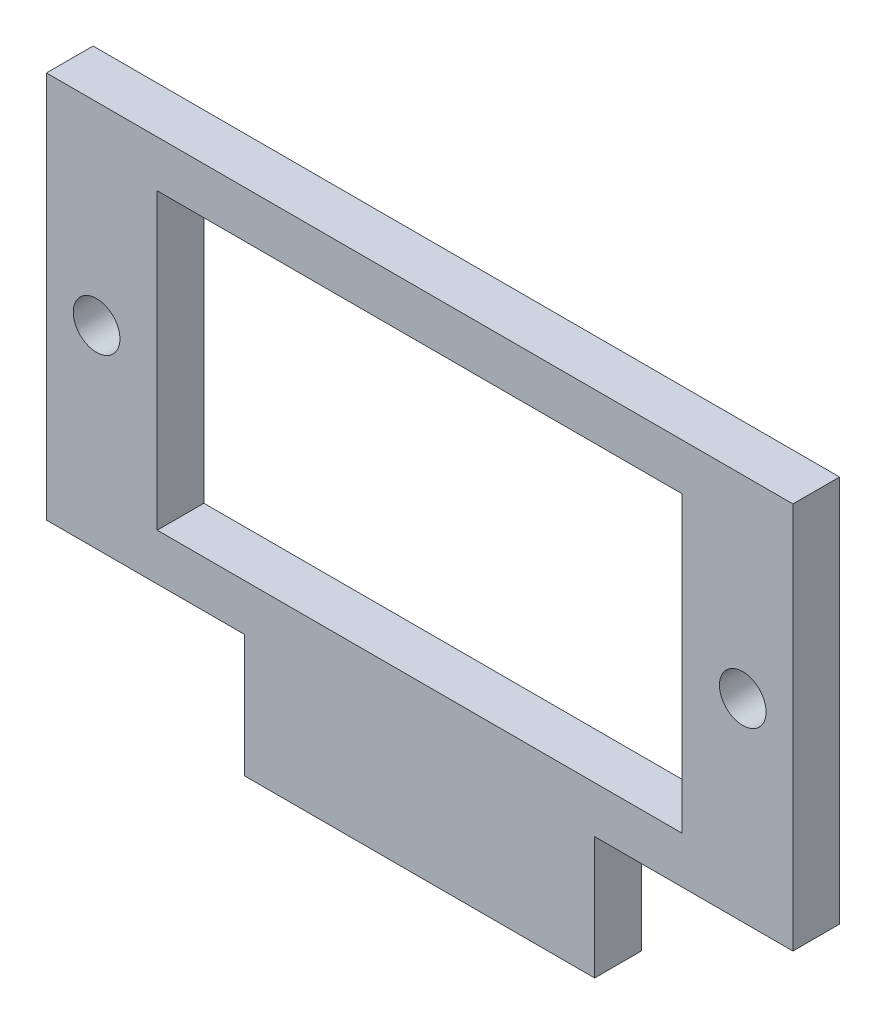
ISO-10303-21;
HEADER;
FILE_DESCRIPTION(('STEP AP214'),'2;1');
FILE_NAME('part.step','',(''),(''),'','','');
FILE_SCHEMA(('AUTOMOTIVE_DESIGN { 1 0 10303 214 1 1 1 1 }'));
ENDSEC;
DATA;
#1=APPLICATION_CONTEXT('core data for automotive mechanical design processes');
#2=APPLICATION_PROTOCOL_DEFINITION('international standard','automotive_design',2000,#1);
#3=PRODUCT_CONTEXT('',#1,'mechanical');
#4=PRODUCT('Part','Part','',(#3));
#5=PRODUCT_RELATED_PRODUCT_CATEGORY('part','',(#4));
#6=PRODUCT_DEFINITION_FORMATION('','',#4);
#7=PRODUCT_DEFINITION_CONTEXT('part definition',#1,'design');
#8=PRODUCT_DEFINITION('design','',#6,#7);
#9=PRODUCT_DEFINITION_SHAPE('','',#8);
#10=(LENGTH_UNIT() NAMED_UNIT(*) SI_UNIT(.MILLI.,.METRE.));
#11=(NAMED_UNIT(*) PLANE_ANGLE_UNIT() SI_UNIT($,.RADIAN.));
#12=(NAMED_UNIT(*) SI_UNIT($,.STERADIAN.) SOLID_ANGLE_UNIT());
#13=UNCERTAINTY_MEASURE_WITH_UNIT(LENGTH_MEASURE(1.E-05),#10,'distance_accuracy_value','');
#14=(GEOMETRIC_REPRESENTATION_CONTEXT(3) GLOBAL_UNCERTAINTY_ASSIGNED_CONTEXT((#13)) GLOBAL_UNIT_ASSIGNED_CONTEXT((#10,
#11,#12)) REPRESENTATION_CONTEXT('',''));
#15=CARTESIAN_POINT('',(0.,0.,0.));
#16=DIRECTION('',(0.,0.,1.));
#17=DIRECTION('',(1.,0.,0.));
#18=AXIS2_PLACEMENT_3D('',#15,#16,#17);
#19=CARTESIAN_POINT('',(-16.,-8.3,2.));
#20=DIRECTION('',(0.,1.,0.));
#21=DIRECTION('',(0.,0.,1.));
#22=AXIS2_PLACEMENT_3D('',#19,#20,#21);
#23=PLANE('',#22);
#24=DIRECTION('',(0.,0.,-1.));
#25=VECTOR('',#24,1.);
#26=CARTESIAN_POINT('',(-7.5,-8.3,2.));
#27=LINE('',#26,#25);
#28=CARTESIAN_POINT('',(-7.5,-8.3,2.));
#29=VERTEX_POINT('',#28);
#30=CARTESIAN_POINT('',(-7.5,-8.3,0.));
#31=VERTEX_POINT('',#30);
#32=EDGE_CURVE('E55',#29,#31,#27,.T.);
#33=ORIENTED_EDGE('',*,*,#32,.F.);
#34=DIRECTION('',(1.,0.,0.));
#35=VECTOR('',#34,1.);
#36=CARTESIAN_POINT('',(-16.,-8.3,2.));
#37=LINE('',#36,#35);
#38=CARTESIAN_POINT('',(-16.,-8.3,2.));
#39=VERTEX_POINT('',#38);
#40=EDGE_CURVE('E235',#39,#29,#37,.T.);
#41=ORIENTED_EDGE('',*,*,#40,.F.);
#42=DIRECTION('',(0.,0.,-1.));
#43=VECTOR('',#42,1.);
#44=CARTESIAN_POINT('',(-16.,-8.3,2.));
#45=LINE('',#44,#43);
#46=CARTESIAN_POINT('',(-16.,-8.3,0.));
#47=VERTEX_POINT('',#46);
#48=EDGE_CURVE('E254',#39,#47,#45,.T.);
#49=ORIENTED_EDGE('',*,*,#48,.T.);
#50=DIRECTION('',(1.,0.,0.));
#51=VECTOR('',#50,1.);
#52=CARTESIAN_POINT('',(-16.,-8.3,0.));
#53=LINE('',#52,#51);
#54=EDGE_CURVE('E228',#47,#31,#53,.T.);
#55=ORIENTED_EDGE('',*,*,#54,.T.);
#56=EDGE_LOOP('',(#33,#41,#49,#55));
#57=FACE_BOUND('',#56,.T.);
#58=ADVANCED_FACE('F39',(#57),#23,.F.);
#59=DIRECTION('',(0.,0.,1.));
#60=VECTOR('',#59,1.);
#61=CARTESIAN_POINT('',(7.5,-8.3,2.));
#62=LINE('',#61,#60);
#63=CARTESIAN_POINT('',(7.5,-8.3,0.));
#64=VERTEX_POINT('',#63);
#65=CARTESIAN_POINT('',(7.5,-8.3,2.));
#66=VERTEX_POINT('',#65);
#67=EDGE_CURVE('E63',#64,#66,#62,.T.);
#68=ORIENTED_EDGE('',*,*,#67,.F.);
#69=CARTESIAN_POINT('',(16.,-8.3,0.));
#70=VERTEX_POINT('',#69);
#71=EDGE_CURVE('E248',#64,#70,#53,.T.);
#72=ORIENTED_EDGE('',*,*,#71,.T.);
#73=DIRECTION('',(0.,0.,-1.));
#74=VECTOR('',#73,1.);
#75=CARTESIAN_POINT('',(16.,-8.3,2.));
#76=LINE('',#75,#74);
#77=CARTESIAN_POINT('',(16.,-8.3,2.));
#78=VERTEX_POINT('',#77);
#79=EDGE_CURVE('E238',#78,#70,#76,.T.);
#80=ORIENTED_EDGE('',*,*,#79,.F.);
#81=EDGE_CURVE('E234',#66,#78,#37,.T.);
#82=ORIENTED_EDGE('',*,*,#81,.F.);
#83=EDGE_LOOP('',(#68,#72,#80,#82));
#84=FACE_BOUND('',#83,.T.);
#85=ADVANCED_FACE('F289',(#84),#23,.F.);
#86=CARTESIAN_POINT('',(0.,0.,2.));
#87=DIRECTION('',(0.,0.,1.));
#88=DIRECTION('',(1.,0.,0.));
#89=AXIS2_PLACEMENT_3D('',#86,#87,#88);
#90=PLANE('',#89);
#91=CARTESIAN_POINT('',(-13.85,0.,2.));
#92=DIRECTION('',(0.,0.,1.));
#93=DIRECTION('',(1.,0.,0.));
#94=AXIS2_PLACEMENT_3D('',#91,#92,#93);
#95=CIRCLE('',#94,1.);
#96=CARTESIAN_POINT('',(-12.85,0.,2.));
#97=VERTEX_POINT('',#96);
#98=EDGE_CURVE('E172',#97,#97,#95,.T.);
#99=ORIENTED_EDGE('',*,*,#98,.F.);
#100=EDGE_LOOP('',(#99));
#101=FACE_BOUND('',#100,.T.);
#102=DIRECTION('',(0.,1.,0.));
#103=VECTOR('',#102,1.);
#104=CARTESIAN_POINT('',(16.,8.3,2.));
#105=LINE('',#104,#103);
#106=CARTESIAN_POINT('',(16.,8.3,2.));
#107=VERTEX_POINT('',#106);
#108=EDGE_CURVE('E223',#78,#107,#105,.T.);
#109=ORIENTED_EDGE('',*,*,#108,.T.);
#110=DIRECTION('',(-1.,0.,0.));
#111=VECTOR('',#110,1.);
#112=CARTESIAN_POINT('',(-16.,8.3,2.));
#113=LINE('',#112,#111);
#114=CARTESIAN_POINT('',(-16.,8.3,2.));
#115=VERTEX_POINT('',#114);
#116=EDGE_CURVE('E227',#107,#115,#113,.T.);
#117=ORIENTED_EDGE('',*,*,#116,.T.);
#118=DIRECTION('',(0.,-1.,0.));
#119=VECTOR('',#118,1.);
#120=CARTESIAN_POINT('',(-16.,8.3,2.));
#121=LINE('',#120,#119);
#122=EDGE_CURVE('E231',#115,#39,#121,.T.);
#123=ORIENTED_EDGE('',*,*,#122,.T.);
#124=ORIENTED_EDGE('',*,*,#40,.T.);
#125=DIRECTION('',(0.,1.,0.));
#126=VECTOR('',#125,1.);
#127=CARTESIAN_POINT('',(-7.5,-13.55,2.));
#128=LINE('',#127,#126);
#129=CARTESIAN_POINT('',(-7.5,-13.55,2.));
#130=VERTEX_POINT('',#129);
#131=EDGE_CURVE('E269',#130,#29,#128,.T.);
#132=ORIENTED_EDGE('',*,*,#131,.F.);
#133=DIRECTION('',(-1.,0.,0.));
#134=VECTOR('',#133,1.);
#135=CARTESIAN_POINT('',(-7.5,-13.55,2.));
#136=LINE('',#135,#134);
#137=CARTESIAN_POINT('',(7.5,-13.55,2.));
#138=VERTEX_POINT('',#137);
#139=EDGE_CURVE('E149',#138,#130,#136,.T.);
#140=ORIENTED_EDGE('',*,*,#139,.F.);
#141=DIRECTION('',(0.,1.,0.));
#142=VECTOR('',#141,1.);
#143=CARTESIAN_POINT('',(7.5,-13.55,2.));
#144=LINE('',#143,#142);
#145=EDGE_CURVE('E164',#138,#66,#144,.T.);
#146=ORIENTED_EDGE('',*,*,#145,.T.);
#147=ORIENTED_EDGE('',*,*,#81,.T.);
#148=EDGE_LOOP('',(#109,#117,#123,#124,#132,#140,#146,#147));
#149=FACE_BOUND('',#148,.T.);
#150=DIRECTION('',(-1.,0.,0.));
#151=VECTOR('',#150,1.);
#152=CARTESIAN_POINT('',(-11.25,6.3,2.));
#153=LINE('',#152,#151);
#154=CARTESIAN_POINT('',(11.25,6.3,2.));
#155=VERTEX_POINT('',#154);
#156=CARTESIAN_POINT('',(-11.25,6.3,2.));
#157=VERTEX_POINT('',#156);
#158=EDGE_CURVE('E183',#155,#157,#153,.T.);
#159=ORIENTED_EDGE('',*,*,#158,.F.);
#160=DIRECTION('',(0.,1.,0.));
#161=VECTOR('',#160,1.);
#162=CARTESIAN_POINT('',(11.25,6.3,2.));
#163=LINE('',#162,#161);
#164=CARTESIAN_POINT('',(11.25,-6.3,2.));
#165=VERTEX_POINT('',#164);
#166=EDGE_CURVE('E180',#165,#155,#163,.T.);
#167=ORIENTED_EDGE('',*,*,#166,.F.);
#168=DIRECTION('',(1.,0.,0.));
#169=VECTOR('',#168,1.);
#170=CARTESIAN_POINT('',(-11.25,-6.3,2.));
#171=LINE('',#170,#169);
#172=CARTESIAN_POINT('',(-11.25,-6.3,2.));
#173=VERTEX_POINT('',#172);
#174=EDGE_CURVE('E191',#173,#165,#171,.T.);
#175=ORIENTED_EDGE('',*,*,#174,.F.);
#176=DIRECTION('',(0.,-1.,0.));
#177=VECTOR('',#176,1.);
#178=CARTESIAN_POINT('',(-11.25,6.3,2.));
#179=LINE('',#178,#177);
#180=EDGE_CURVE('E187',#157,#173,#179,.T.);
#181=ORIENTED_EDGE('',*,*,#180,.F.);
#182=EDGE_LOOP('',(#159,#167,#175,#181));
#183=FACE_BOUND('',#182,.T.);
#184=CARTESIAN_POINT('',(13.85,0.,2.));
#185=DIRECTION('',(0.,0.,1.));
#186=DIRECTION('',(1.,0.,0.));
#187=AXIS2_PLACEMENT_3D('',#184,#185,#186);
#188=CIRCLE('',#187,1.);
#189=CARTESIAN_POINT('',(14.85,0.,2.));
#190=VERTEX_POINT('',#189);
#191=EDGE_CURVE('E162',#190,#190,#188,.T.);
#192=ORIENTED_EDGE('',*,*,#191,.F.);
#193=EDGE_LOOP('',(#192));
#194=FACE_BOUND('',#193,.T.);
#195=ADVANCED_FACE('F267',(#101,#149,#183,#194),#90,.T.);
#196=CARTESIAN_POINT('',(0.,0.,0.));
#197=DIRECTION('',(0.,0.,1.));
#198=DIRECTION('',(1.,0.,0.));
#199=AXIS2_PLACEMENT_3D('',#196,#197,#198);
#200=PLANE('',#199);
#201=DIRECTION('',(0.,1.,0.));
#202=VECTOR('',#201,1.);
#203=CARTESIAN_POINT('',(16.,8.3,0.));
#204=LINE('',#203,#202);
#205=CARTESIAN_POINT('',(16.,8.3,0.));
#206=VERTEX_POINT('',#205);
#207=EDGE_CURVE('E222',#70,#206,#204,.T.);
#208=ORIENTED_EDGE('',*,*,#207,.F.);
#209=ORIENTED_EDGE('',*,*,#71,.F.);
#210=DIRECTION('',(0.,1.,0.));
#211=VECTOR('',#210,1.);
#212=CARTESIAN_POINT('',(7.5,-13.55,0.));
#213=LINE('',#212,#211);
#214=CARTESIAN_POINT('',(7.5,-13.55,0.));
#215=VERTEX_POINT('',#214);
#216=EDGE_CURVE('E139',#215,#64,#213,.T.);
#217=ORIENTED_EDGE('',*,*,#216,.F.);
#218=DIRECTION('',(1.,0.,0.));
#219=VECTOR('',#218,1.);
#220=CARTESIAN_POINT('',(-7.5,-13.55,0.));
#221=LINE('',#220,#219);
#222=CARTESIAN_POINT('',(-7.5,-13.55,0.));
#223=VERTEX_POINT('',#222);
#224=EDGE_CURVE('E130',#223,#215,#221,.T.);
#225=ORIENTED_EDGE('',*,*,#224,.F.);
#226=DIRECTION('',(0.,1.,0.));
#227=VECTOR('',#226,1.);
#228=CARTESIAN_POINT('',(-7.5,-13.55,0.));
#229=LINE('',#228,#227);
#230=EDGE_CURVE('E137',#223,#31,#229,.T.);
#231=ORIENTED_EDGE('',*,*,#230,.T.);
#232=ORIENTED_EDGE('',*,*,#54,.F.);
#233=DIRECTION('',(0.,-1.,0.));
#234=VECTOR('',#233,1.);
#235=CARTESIAN_POINT('',(-16.,8.3,0.));
#236=LINE('',#235,#234);
#237=CARTESIAN_POINT('',(-16.,8.3,0.));
#238=VERTEX_POINT('',#237);
#239=EDGE_CURVE('E245',#238,#47,#236,.T.);
#240=ORIENTED_EDGE('',*,*,#239,.F.);
#241=DIRECTION('',(-1.,0.,0.));
#242=VECTOR('',#241,1.);
#243=CARTESIAN_POINT('',(-16.,8.3,0.));
#244=LINE('',#243,#242);
#245=EDGE_CURVE('E242',#206,#238,#244,.T.);
#246=ORIENTED_EDGE('',*,*,#245,.F.);
#247=EDGE_LOOP('',(#208,#209,#217,#225,#231,#232,#240,#246));
#248=FACE_BOUND('',#247,.T.);
#249=DIRECTION('',(0.,1.,0.));
#250=VECTOR('',#249,1.);
#251=CARTESIAN_POINT('',(11.25,6.3,0.));
#252=LINE('',#251,#250);
#253=CARTESIAN_POINT('',(11.25,-6.3,0.));
#254=VERTEX_POINT('',#253);
#255=CARTESIAN_POINT('',(11.25,6.3,0.));
#256=VERTEX_POINT('',#255);
#257=EDGE_CURVE('E176',#254,#256,#252,.T.);
#258=ORIENTED_EDGE('',*,*,#257,.T.);
#259=DIRECTION('',(-1.,0.,0.));
#260=VECTOR('',#259,1.);
#261=CARTESIAN_POINT('',(-11.25,6.3,0.));
#262=LINE('',#261,#260);
#263=CARTESIAN_POINT('',(-11.25,6.3,0.));
#264=VERTEX_POINT('',#263);
#265=EDGE_CURVE('E198',#256,#264,#262,.T.);
#266=ORIENTED_EDGE('',*,*,#265,.T.);
#267=DIRECTION('',(0.,-1.,0.));
#268=VECTOR('',#267,1.);
#269=CARTESIAN_POINT('',(-11.25,6.3,0.));
#270=LINE('',#269,#268);
#271=CARTESIAN_POINT('',(-11.25,-6.3,0.));
#272=VERTEX_POINT('',#271);
#273=EDGE_CURVE('E202',#264,#272,#270,.T.);
#274=ORIENTED_EDGE('',*,*,#273,.T.);
#275=DIRECTION('',(1.,0.,0.));
#276=VECTOR('',#275,1.);
#277=CARTESIAN_POINT('',(-11.25,-6.3,0.));
#278=LINE('',#277,#276);
#279=EDGE_CURVE('E184',#272,#254,#278,.T.);
#280=ORIENTED_EDGE('',*,*,#279,.T.);
#281=EDGE_LOOP('',(#258,#266,#274,#280));
#282=FACE_BOUND('',#281,.T.);
#283=CARTESIAN_POINT('',(-13.85,0.,0.));
#284=DIRECTION('',(0.,0.,1.));
#285=DIRECTION('',(1.,0.,0.));
#286=AXIS2_PLACEMENT_3D('',#283,#284,#285);
#287=CIRCLE('',#286,1.);
#288=CARTESIAN_POINT('',(-12.85,0.,0.));
#289=VERTEX_POINT('',#288);
#290=EDGE_CURVE('E170',#289,#289,#287,.T.);
#291=ORIENTED_EDGE('',*,*,#290,.T.);
#292=EDGE_LOOP('',(#291));
#293=FACE_BOUND('',#292,.T.);
#294=CARTESIAN_POINT('',(13.85,0.,0.));
#295=DIRECTION('',(0.,0.,1.));
#296=DIRECTION('',(1.,0.,0.));
#297=AXIS2_PLACEMENT_3D('',#294,#295,#296);
#298=CIRCLE('',#297,1.);
#299=CARTESIAN_POINT('',(14.85,0.,0.));
#300=VERTEX_POINT('',#299);
#301=EDGE_CURVE('E157',#300,#300,#298,.T.);
#302=ORIENTED_EDGE('',*,*,#301,.T.);
#303=EDGE_LOOP('',(#302));
#304=FACE_BOUND('',#303,.T.);
#305=ADVANCED_FACE('F133',(#248,#282,#293,#304),#200,.F.);
#306=CARTESIAN_POINT('',(16.,8.3,2.));
#307=DIRECTION('',(-1.,0.,0.));
#308=DIRECTION('',(0.,0.,1.));
#309=AXIS2_PLACEMENT_3D('',#306,#307,#308);
#310=PLANE('',#309);
#311=ORIENTED_EDGE('',*,*,#207,.T.);
#312=DIRECTION('',(0.,0.,-1.));
#313=VECTOR('',#312,1.);
#314=CARTESIAN_POINT('',(16.,8.3,2.));
#315=LINE('',#314,#313);
#316=EDGE_CURVE('E11',#107,#206,#315,.T.);
#317=ORIENTED_EDGE('',*,*,#316,.F.);
#318=ORIENTED_EDGE('',*,*,#108,.F.);
#319=ORIENTED_EDGE('',*,*,#79,.T.);
#320=EDGE_LOOP('',(#311,#317,#318,#319));
#321=FACE_BOUND('',#320,.T.);
#322=ADVANCED_FACE('F41',(#321),#310,.F.);
#323=CARTESIAN_POINT('',(-16.,8.3,2.));
#324=DIRECTION('',(0.,-1.,0.));
#325=DIRECTION('',(0.,0.,-1.));
#326=AXIS2_PLACEMENT_3D('',#323,#324,#325);
#327=PLANE('',#326);
#328=ORIENTED_EDGE('',*,*,#245,.T.);
#329=DIRECTION('',(0.,0.,-1.));
#330=VECTOR('',#329,1.);
#331=CARTESIAN_POINT('',(-16.,8.3,2.));
#332=LINE('',#331,#330);
#333=EDGE_CURVE('E48',#115,#238,#332,.T.);
#334=ORIENTED_EDGE('',*,*,#333,.F.);
#335=ORIENTED_EDGE('',*,*,#116,.F.);
#336=ORIENTED_EDGE('',*,*,#316,.T.);
#337=EDGE_LOOP('',(#328,#334,#335,#336));
#338=FACE_BOUND('',#337,.T.);
#339=ADVANCED_FACE('F291',(#338),#327,.F.);
#340=CARTESIAN_POINT('',(-16.,8.3,2.));
#341=DIRECTION('',(1.,0.,0.));
#342=DIRECTION('',(0.,0.,-1.));
#343=AXIS2_PLACEMENT_3D('',#340,#341,#342);
#344=PLANE('',#343);
#345=ORIENTED_EDGE('',*,*,#239,.T.);
#346=ORIENTED_EDGE('',*,*,#48,.F.);
#347=ORIENTED_EDGE('',*,*,#122,.F.);
#348=ORIENTED_EDGE('',*,*,#333,.T.);
#349=EDGE_LOOP('',(#345,#346,#347,#348));
#350=FACE_BOUND('',#349,.T.);
#351=ADVANCED_FACE('F263',(#350),#344,.F.);
#352=CARTESIAN_POINT('',(11.25,6.3,2.));
#353=DIRECTION('',(-1.,0.,0.));
#354=DIRECTION('',(0.,0.,1.));
#355=AXIS2_PLACEMENT_3D('',#352,#353,#354);
#356=PLANE('',#355);
#357=ORIENTED_EDGE('',*,*,#257,.F.);
#358=DIRECTION('',(0.,0.,-1.));
#359=VECTOR('',#358,1.);
#360=CARTESIAN_POINT('',(11.25,-6.3,2.));
#361=LINE('',#360,#359);
#362=EDGE_CURVE('E194',#165,#254,#361,.T.);
#363=ORIENTED_EDGE('',*,*,#362,.F.);
#364=ORIENTED_EDGE('',*,*,#166,.T.);
#365=DIRECTION('',(0.,0.,-1.));
#366=VECTOR('',#365,1.);
#367=CARTESIAN_POINT('',(11.25,6.3,2.));
#368=LINE('',#367,#366);
#369=EDGE_CURVE('E218',#155,#256,#368,.T.);
#370=ORIENTED_EDGE('',*,*,#369,.T.);
#371=EDGE_LOOP('',(#357,#363,#364,#370));
#372=FACE_BOUND('',#371,.T.);
#373=ADVANCED_FACE('F297',(#372),#356,.T.);
#374=CARTESIAN_POINT('',(-11.25,6.3,2.));
#375=DIRECTION('',(0.,-1.,0.));
#376=DIRECTION('',(0.,0.,-1.));
#377=AXIS2_PLACEMENT_3D('',#374,#375,#376);
#378=PLANE('',#377);
#379=ORIENTED_EDGE('',*,*,#265,.F.);
#380=ORIENTED_EDGE('',*,*,#369,.F.);
#381=ORIENTED_EDGE('',*,*,#158,.T.);
#382=DIRECTION('',(0.,0.,-1.));
#383=VECTOR('',#382,1.);
#384=CARTESIAN_POINT('',(-11.25,6.3,2.));
#385=LINE('',#384,#383);
#386=EDGE_CURVE('E215',#157,#264,#385,.T.);
#387=ORIENTED_EDGE('',*,*,#386,.T.);
#388=EDGE_LOOP('',(#379,#380,#381,#387));
#389=FACE_BOUND('',#388,.T.);
#390=ADVANCED_FACE('F312',(#389),#378,.T.);
#391=CARTESIAN_POINT('',(-11.25,6.3,2.));
#392=DIRECTION('',(1.,0.,0.));
#393=DIRECTION('',(0.,0.,-1.));
#394=AXIS2_PLACEMENT_3D('',#391,#392,#393);
#395=PLANE('',#394);
#396=ORIENTED_EDGE('',*,*,#273,.F.);
#397=ORIENTED_EDGE('',*,*,#386,.F.);
#398=ORIENTED_EDGE('',*,*,#180,.T.);
#399=DIRECTION('',(0.,0.,-1.));
#400=VECTOR('',#399,1.);
#401=CARTESIAN_POINT('',(-11.25,-6.3,2.));
#402=LINE('',#401,#400);
#403=EDGE_CURVE('E212',#173,#272,#402,.T.);
#404=ORIENTED_EDGE('',*,*,#403,.T.);
#405=EDGE_LOOP('',(#396,#397,#398,#404));
#406=FACE_BOUND('',#405,.T.);
#407=ADVANCED_FACE('F316',(#406),#395,.T.);
#408=CARTESIAN_POINT('',(-11.25,-6.3,2.));
#409=DIRECTION('',(0.,1.,0.));
#410=DIRECTION('',(0.,0.,1.));
#411=AXIS2_PLACEMENT_3D('',#408,#409,#410);
#412=PLANE('',#411);
#413=ORIENTED_EDGE('',*,*,#279,.F.);
#414=ORIENTED_EDGE('',*,*,#403,.F.);
#415=ORIENTED_EDGE('',*,*,#174,.T.);
#416=ORIENTED_EDGE('',*,*,#362,.T.);
#417=EDGE_LOOP('',(#413,#414,#415,#416));
#418=FACE_BOUND('',#417,.T.);
#419=ADVANCED_FACE('F320',(#418),#412,.T.);
#420=CARTESIAN_POINT('',(-13.85,0.,2.));
#421=DIRECTION('',(0.,0.,-1.));
#422=DIRECTION('',(-1.,0.,0.));
#423=AXIS2_PLACEMENT_3D('',#420,#421,#422);
#424=CYLINDRICAL_SURFACE('',#423,1.);
#425=ORIENTED_EDGE('',*,*,#98,.T.);
#426=EDGE_LOOP('',(#425));
#427=FACE_BOUND('',#426,.T.);
#428=ORIENTED_EDGE('',*,*,#290,.F.);
#429=EDGE_LOOP('',(#428));
#430=FACE_BOUND('',#429,.T.);
#431=ADVANCED_FACE('F324',(#427,#430),#424,.F.);
#432=CARTESIAN_POINT('',(13.85,0.,2.));
#433=DIRECTION('',(0.,0.,-1.));
#434=DIRECTION('',(-1.,0.,0.));
#435=AXIS2_PLACEMENT_3D('',#432,#433,#434);
#436=CYLINDRICAL_SURFACE('',#435,1.);
#437=ORIENTED_EDGE('',*,*,#191,.T.);
#438=EDGE_LOOP('',(#437));
#439=FACE_BOUND('',#438,.T.);
#440=ORIENTED_EDGE('',*,*,#301,.F.);
#441=EDGE_LOOP('',(#440));
#442=FACE_BOUND('',#441,.T.);
#443=ADVANCED_FACE('F328',(#439,#442),#436,.F.);
#444=CARTESIAN_POINT('',(-7.5,-13.55,2.));
#445=DIRECTION('',(1.,0.,0.));
#446=DIRECTION('',(0.,0.,-1.));
#447=AXIS2_PLACEMENT_3D('',#444,#445,#446);
#448=PLANE('',#447);
#449=ORIENTED_EDGE('',*,*,#32,.T.);
#450=ORIENTED_EDGE('',*,*,#230,.F.);
#451=DIRECTION('',(0.,0.,-1.));
#452=VECTOR('',#451,1.);
#453=CARTESIAN_POINT('',(-7.5,-13.55,2.));
#454=LINE('',#453,#452);
#455=EDGE_CURVE('E144',#130,#223,#454,.T.);
#456=ORIENTED_EDGE('',*,*,#455,.F.);
#457=ORIENTED_EDGE('',*,*,#131,.T.);
#458=EDGE_LOOP('',(#449,#450,#456,#457));
#459=FACE_BOUND('',#458,.T.);
#460=ADVANCED_FACE('F155',(#459),#448,.F.);
#461=CARTESIAN_POINT('',(7.5,-13.55,2.));
#462=DIRECTION('',(-1.,0.,0.));
#463=DIRECTION('',(0.,0.,1.));
#464=AXIS2_PLACEMENT_3D('',#461,#462,#463);
#465=PLANE('',#464);
#466=ORIENTED_EDGE('',*,*,#67,.T.);
#467=ORIENTED_EDGE('',*,*,#145,.F.);
#468=DIRECTION('',(0.,0.,1.));
#469=VECTOR('',#468,1.);
#470=CARTESIAN_POINT('',(7.5,-13.55,2.));
#471=LINE('',#470,#469);
#472=EDGE_CURVE('E143',#215,#138,#471,.T.);
#473=ORIENTED_EDGE('',*,*,#472,.F.);
#474=ORIENTED_EDGE('',*,*,#216,.T.);
#475=EDGE_LOOP('',(#466,#467,#473,#474));
#476=FACE_BOUND('',#475,.T.);
#477=ADVANCED_FACE('F284',(#476),#465,.F.);
#478=CARTESIAN_POINT('',(0.,-13.55,0.));
#479=DIRECTION('',(0.,-1.,0.));
#480=DIRECTION('',(0.,0.,-1.));
#481=AXIS2_PLACEMENT_3D('',#478,#479,#480);
#482=PLANE('',#481);
#483=ORIENTED_EDGE('',*,*,#455,.T.);
#484=ORIENTED_EDGE('',*,*,#224,.T.);
#485=ORIENTED_EDGE('',*,*,#472,.T.);
#486=ORIENTED_EDGE('',*,*,#139,.T.);
#487=EDGE_LOOP('',(#483,#484,#485,#486));
#488=FACE_BOUND('',#487,.T.);
#489=ADVANCED_FACE('F147',(#488),#482,.T.);
#490=CLOSED_SHELL('',(#58,#85,#195,#305,#322,#339,#351,#373,#390,#407,#419,#431,#443,#460,#477,#489));
#491=MANIFOLD_SOLID_BREP('B2',#490);
#492=ADVANCED_BREP_SHAPE_REPRESENTATION('',(#18,#491),#14);
#493=SHAPE_DEFINITION_REPRESENTATION(#9,#492);
ENDSEC;
END-ISO-10303-21;
